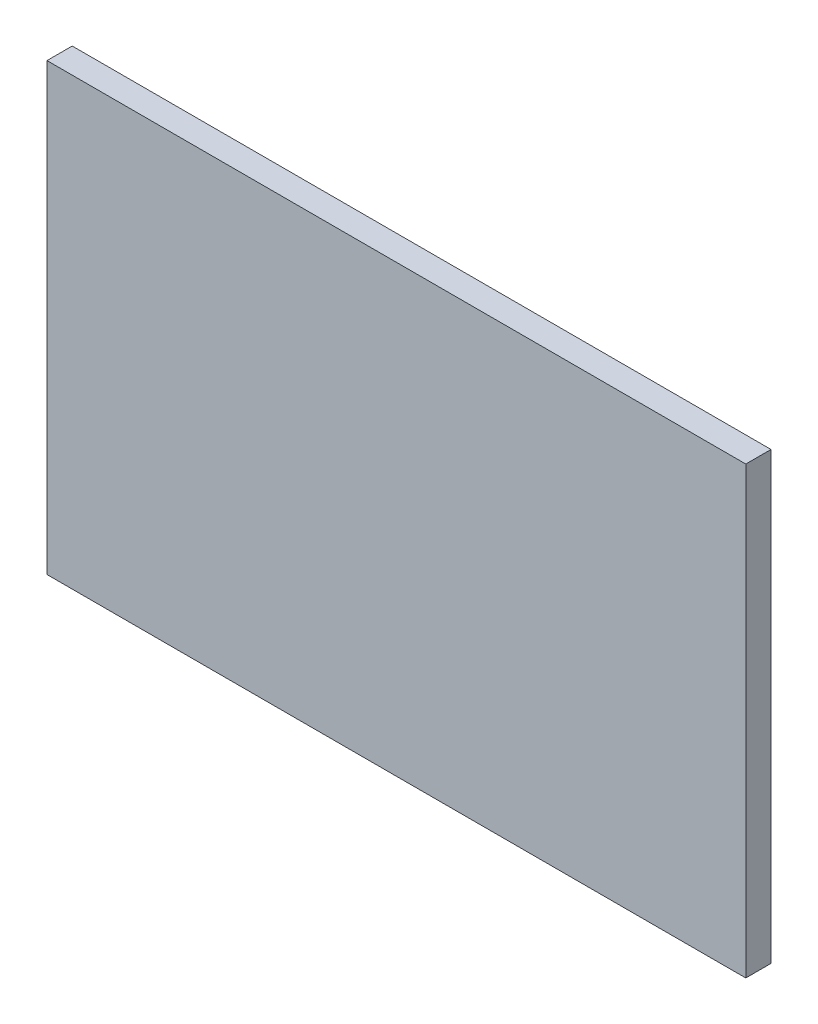
ISO-10303-21;
HEADER;
FILE_DESCRIPTION(('STEP AP214'),'2;1');
FILE_NAME('part.step','',(''),(''),'','','');
FILE_SCHEMA(('AUTOMOTIVE_DESIGN { 1 0 10303 214 1 1 1 1 }'));
ENDSEC;
DATA;
#1=APPLICATION_CONTEXT('core data for automotive mechanical design processes');
#2=APPLICATION_PROTOCOL_DEFINITION('international standard','automotive_design',2000,#1);
#3=PRODUCT_CONTEXT('',#1,'mechanical');
#4=PRODUCT('Part','Part','',(#3));
#5=PRODUCT_RELATED_PRODUCT_CATEGORY('part','',(#4));
#6=PRODUCT_DEFINITION_FORMATION('','',#4);
#7=PRODUCT_DEFINITION_CONTEXT('part definition',#1,'design');
#8=PRODUCT_DEFINITION('design','',#6,#7);
#9=PRODUCT_DEFINITION_SHAPE('','',#8);
#10=(LENGTH_UNIT() NAMED_UNIT(*) SI_UNIT(.MILLI.,.METRE.));
#11=(NAMED_UNIT(*) PLANE_ANGLE_UNIT() SI_UNIT($,.RADIAN.));
#12=(NAMED_UNIT(*) SI_UNIT($,.STERADIAN.) SOLID_ANGLE_UNIT());
#13=UNCERTAINTY_MEASURE_WITH_UNIT(LENGTH_MEASURE(1.E-05),#10,'distance_accuracy_value','');
#14=(GEOMETRIC_REPRESENTATION_CONTEXT(3) GLOBAL_UNCERTAINTY_ASSIGNED_CONTEXT((#13)) GLOBAL_UNIT_ASSIGNED_CONTEXT((#10,
#11,#12)) REPRESENTATION_CONTEXT('',''));
#15=CARTESIAN_POINT('',(0.,0.,0.));
#16=DIRECTION('',(0.,0.,1.));
#17=DIRECTION('',(1.,0.,0.));
#18=AXIS2_PLACEMENT_3D('',#15,#16,#17);
#19=CARTESIAN_POINT('',(-52.7558,-33.6042,3.81));
#20=DIRECTION('',(1.,0.,0.));
#21=DIRECTION('',(0.,0.,-1.));
#22=AXIS2_PLACEMENT_3D('',#19,#20,#21);
#23=PLANE('',#22);
#24=DIRECTION('',(0.,-1.,0.));
#25=VECTOR('',#24,1.);
#26=CARTESIAN_POINT('',(-52.7558,-33.6042,0.));
#27=LINE('',#26,#25);
#28=CARTESIAN_POINT('',(-52.7558,33.6042,0.));
#29=VERTEX_POINT('',#28);
#30=CARTESIAN_POINT('',(-52.7558,-33.6042,0.));
#31=VERTEX_POINT('',#30);
#32=EDGE_CURVE('E107',#29,#31,#27,.T.);
#33=ORIENTED_EDGE('',*,*,#32,.T.);
#34=DIRECTION('',(0.,0.,-1.));
#35=VECTOR('',#34,1.);
#36=CARTESIAN_POINT('',(-52.7558,-33.6042,3.81));
#37=LINE('',#36,#35);
#38=CARTESIAN_POINT('',(-52.7558,-33.6042,3.81));
#39=VERTEX_POINT('',#38);
#40=EDGE_CURVE('E11',#39,#31,#37,.T.);
#41=ORIENTED_EDGE('',*,*,#40,.F.);
#42=DIRECTION('',(0.,-1.,0.));
#43=VECTOR('',#42,1.);
#44=CARTESIAN_POINT('',(-52.7558,-33.6042,3.81));
#45=LINE('',#44,#43);
#46=CARTESIAN_POINT('',(-52.7558,33.6042,3.81));
#47=VERTEX_POINT('',#46);
#48=EDGE_CURVE('E91',#47,#39,#45,.T.);
#49=ORIENTED_EDGE('',*,*,#48,.F.);
#50=DIRECTION('',(0.,0.,-1.));
#51=VECTOR('',#50,1.);
#52=CARTESIAN_POINT('',(-52.7558,33.6042,3.81));
#53=LINE('',#52,#51);
#54=EDGE_CURVE('E103',#47,#29,#53,.T.);
#55=ORIENTED_EDGE('',*,*,#54,.T.);
#56=EDGE_LOOP('',(#33,#41,#49,#55));
#57=FACE_BOUND('',#56,.T.);
#58=ADVANCED_FACE('F39',(#57),#23,.F.);
#59=CARTESIAN_POINT('',(52.7558,-33.6042,3.81));
#60=DIRECTION('',(0.,1.,0.));
#61=DIRECTION('',(-1.,0.,0.));
#62=AXIS2_PLACEMENT_3D('',#59,#60,#61);
#63=PLANE('',#62);
#64=DIRECTION('',(1.,0.,0.));
#65=VECTOR('',#64,1.);
#66=CARTESIAN_POINT('',(52.7558,-33.6042,0.));
#67=LINE('',#66,#65);
#68=CARTESIAN_POINT('',(52.7558,-33.6042,0.));
#69=VERTEX_POINT('',#68);
#70=EDGE_CURVE('E96',#31,#69,#67,.T.);
#71=ORIENTED_EDGE('',*,*,#70,.T.);
#72=DIRECTION('',(0.,0.,-1.));
#73=VECTOR('',#72,1.);
#74=CARTESIAN_POINT('',(52.7558,-33.6042,3.81));
#75=LINE('',#74,#73);
#76=CARTESIAN_POINT('',(52.7558,-33.6042,3.81));
#77=VERTEX_POINT('',#76);
#78=EDGE_CURVE('E48',#77,#69,#75,.T.);
#79=ORIENTED_EDGE('',*,*,#78,.F.);
#80=DIRECTION('',(1.,0.,0.));
#81=VECTOR('',#80,1.);
#82=CARTESIAN_POINT('',(52.7558,-33.6042,3.81));
#83=LINE('',#82,#81);
#84=EDGE_CURVE('E86',#39,#77,#83,.T.);
#85=ORIENTED_EDGE('',*,*,#84,.F.);
#86=ORIENTED_EDGE('',*,*,#40,.T.);
#87=EDGE_LOOP('',(#71,#79,#85,#86));
#88=FACE_BOUND('',#87,.T.);
#89=ADVANCED_FACE('F95',(#88),#63,.F.);
#90=CARTESIAN_POINT('',(52.7558,-33.6042,3.81));
#91=DIRECTION('',(-1.,0.,0.));
#92=DIRECTION('',(0.,0.,1.));
#93=AXIS2_PLACEMENT_3D('',#90,#91,#92);
#94=PLANE('',#93);
#95=DIRECTION('',(0.,1.,0.));
#96=VECTOR('',#95,1.);
#97=CARTESIAN_POINT('',(52.7558,-33.6042,0.));
#98=LINE('',#97,#96);
#99=CARTESIAN_POINT('',(52.7558,33.6042,0.));
#100=VERTEX_POINT('',#99);
#101=EDGE_CURVE('E73',#69,#100,#98,.T.);
#102=ORIENTED_EDGE('',*,*,#101,.T.);
#103=DIRECTION('',(0.,0.,-1.));
#104=VECTOR('',#103,1.);
#105=CARTESIAN_POINT('',(52.7558,33.6042,3.81));
#106=LINE('',#105,#104);
#107=CARTESIAN_POINT('',(52.7558,33.6042,3.81));
#108=VERTEX_POINT('',#107);
#109=EDGE_CURVE('E98',#108,#100,#106,.T.);
#110=ORIENTED_EDGE('',*,*,#109,.F.);
#111=DIRECTION('',(0.,1.,0.));
#112=VECTOR('',#111,1.);
#113=CARTESIAN_POINT('',(52.7558,-33.6042,3.81));
#114=LINE('',#113,#112);
#115=EDGE_CURVE('E89',#77,#108,#114,.T.);
#116=ORIENTED_EDGE('',*,*,#115,.F.);
#117=ORIENTED_EDGE('',*,*,#78,.T.);
#118=EDGE_LOOP('',(#102,#110,#116,#117));
#119=FACE_BOUND('',#118,.T.);
#120=ADVANCED_FACE('F99',(#119),#94,.F.);
#121=CARTESIAN_POINT('',(52.7558,33.6042,3.81));
#122=DIRECTION('',(0.,-1.,0.));
#123=DIRECTION('',(1.,0.,0.));
#124=AXIS2_PLACEMENT_3D('',#121,#122,#123);
#125=PLANE('',#124);
#126=DIRECTION('',(-1.,0.,0.));
#127=VECTOR('',#126,1.);
#128=CARTESIAN_POINT('',(52.7558,33.6042,0.));
#129=LINE('',#128,#127);
#130=EDGE_CURVE('E79',#100,#29,#129,.T.);
#131=ORIENTED_EDGE('',*,*,#130,.T.);
#132=ORIENTED_EDGE('',*,*,#54,.F.);
#133=DIRECTION('',(-1.,0.,0.));
#134=VECTOR('',#133,1.);
#135=CARTESIAN_POINT('',(52.7558,33.6042,3.81));
#136=LINE('',#135,#134);
#137=EDGE_CURVE('E56',#108,#47,#136,.T.);
#138=ORIENTED_EDGE('',*,*,#137,.F.);
#139=ORIENTED_EDGE('',*,*,#109,.T.);
#140=EDGE_LOOP('',(#131,#132,#138,#139));
#141=FACE_BOUND('',#140,.T.);
#142=ADVANCED_FACE('F120',(#141),#125,.F.);
#143=CARTESIAN_POINT('',(0.,0.,3.81));
#144=DIRECTION('',(0.,0.,1.));
#145=DIRECTION('',(1.,0.,0.));
#146=AXIS2_PLACEMENT_3D('',#143,#144,#145);
#147=PLANE('',#146);
#148=ORIENTED_EDGE('',*,*,#48,.T.);
#149=ORIENTED_EDGE('',*,*,#84,.T.);
#150=ORIENTED_EDGE('',*,*,#115,.T.);
#151=ORIENTED_EDGE('',*,*,#137,.T.);
#152=EDGE_LOOP('',(#148,#149,#150,#151));
#153=FACE_BOUND('',#152,.T.);
#154=ADVANCED_FACE('F87',(#153),#147,.T.);
#155=CARTESIAN_POINT('',(0.,0.,0.));
#156=DIRECTION('',(0.,0.,1.));
#157=DIRECTION('',(1.,0.,0.));
#158=AXIS2_PLACEMENT_3D('',#155,#156,#157);
#159=PLANE('',#158);
#160=ORIENTED_EDGE('',*,*,#32,.F.);
#161=ORIENTED_EDGE('',*,*,#130,.F.);
#162=ORIENTED_EDGE('',*,*,#101,.F.);
#163=ORIENTED_EDGE('',*,*,#70,.F.);
#164=EDGE_LOOP('',(#160,#161,#162,#163));
#165=FACE_BOUND('',#164,.T.);
#166=ADVANCED_FACE('F123',(#165),#159,.F.);
#167=CLOSED_SHELL('',(#58,#89,#120,#142,#154,#166));
#168=MANIFOLD_SOLID_BREP('B2',#167);
#169=ADVANCED_BREP_SHAPE_REPRESENTATION('',(#18,#168),#14);
#170=SHAPE_DEFINITION_REPRESENTATION(#9,#169);
ENDSEC;
END-ISO-10303-21;
